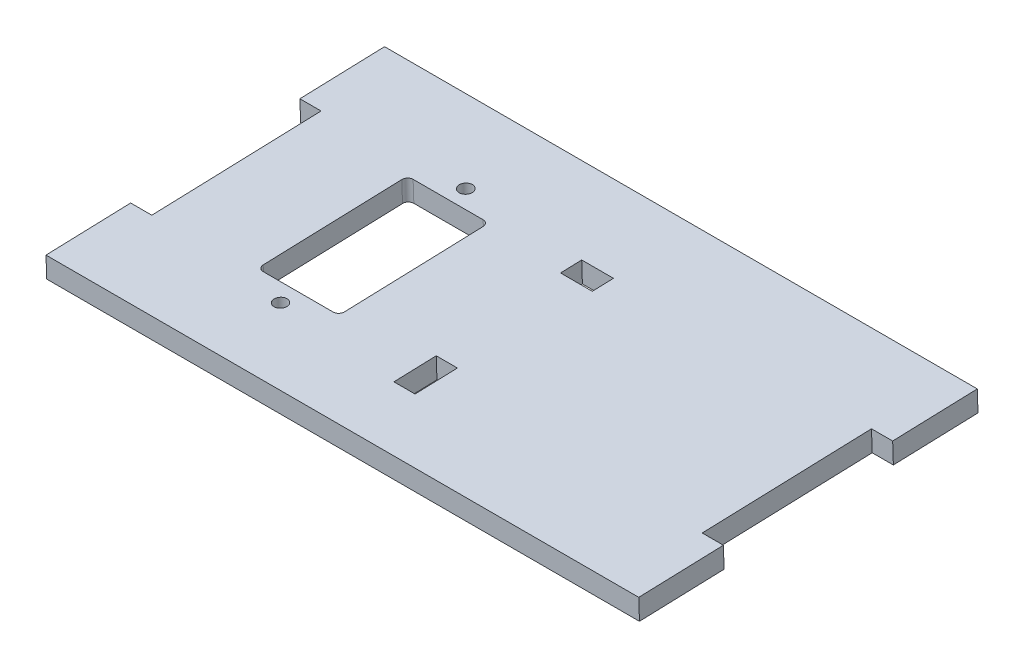
ISO-10303-21;
HEADER;
FILE_DESCRIPTION(('STEP AP214'),'2;1');
FILE_NAME('part.step','',(''),(''),'','','');
FILE_SCHEMA(('AUTOMOTIVE_DESIGN { 1 0 10303 214 1 1 1 1 }'));
ENDSEC;
DATA;
#1=APPLICATION_CONTEXT('core data for automotive mechanical design processes');
#2=APPLICATION_PROTOCOL_DEFINITION('international standard','automotive_design',2000,#1);
#3=PRODUCT_CONTEXT('',#1,'mechanical');
#4=PRODUCT('Part','Part','',(#3));
#5=PRODUCT_RELATED_PRODUCT_CATEGORY('part','',(#4));
#6=PRODUCT_DEFINITION_FORMATION('','',#4);
#7=PRODUCT_DEFINITION_CONTEXT('part definition',#1,'design');
#8=PRODUCT_DEFINITION('design','',#6,#7);
#9=PRODUCT_DEFINITION_SHAPE('','',#8);
#10=(LENGTH_UNIT() NAMED_UNIT(*) SI_UNIT(.MILLI.,.METRE.));
#11=(NAMED_UNIT(*) PLANE_ANGLE_UNIT() SI_UNIT($,.RADIAN.));
#12=(NAMED_UNIT(*) SI_UNIT($,.STERADIAN.) SOLID_ANGLE_UNIT());
#13=UNCERTAINTY_MEASURE_WITH_UNIT(LENGTH_MEASURE(1.E-05),#10,'distance_accuracy_value','');
#14=(GEOMETRIC_REPRESENTATION_CONTEXT(3) GLOBAL_UNCERTAINTY_ASSIGNED_CONTEXT((#13)) GLOBAL_UNIT_ASSIGNED_CONTEXT((#10,
#11,#12)) REPRESENTATION_CONTEXT('',''));
#15=CARTESIAN_POINT('',(0.,0.,0.));
#16=DIRECTION('',(0.,0.,1.));
#17=DIRECTION('',(1.,0.,0.));
#18=AXIS2_PLACEMENT_3D('',#15,#16,#17);
#19=CARTESIAN_POINT('',(0.,92.1531403658076,3.05679372771812));
#20=DIRECTION('',(0.,0.999450302475041,0.033152569772926));
#21=DIRECTION('',(0.,-0.033152569772926,0.999450302475041));
#22=AXIS2_PLACEMENT_3D('',#19,#20,#21);
#23=PLANE('',#22);
#24=CARTESIAN_POINT('',(8.37075843968437,75.2823159082097,511.661427475282));
#25=DIRECTION('',(0.,0.999450302475041,0.0331525697729258));
#26=DIRECTION('',(0.,-0.0331525697729258,0.999450302475041));
#27=AXIS2_PLACEMENT_3D('',#24,#25,#26);
#28=CIRCLE('',#27,0.979512635071814);
#29=CARTESIAN_POINT('',(8.37075843968437,75.249842547232,512.640401674683));
#30=VERTEX_POINT('',#29);
#31=EDGE_CURVE('E289',#30,#30,#28,.T.);
#32=ORIENTED_EDGE('',*,*,#31,.F.);
#33=EDGE_LOOP('',(#32));
#34=FACE_BOUND('',#33,.T.);
#35=DIRECTION('',(1.,0.,0.));
#36=VECTOR('',#35,1.);
#37=CARTESIAN_POINT('',(69.9558848829245,76.179424446265,484.616302290307));
#38=LINE('',#37,#36);
#39=CARTESIAN_POINT('',(69.9558848829245,76.179424446265,484.616302290307));
#40=VERTEX_POINT('',#39);
#41=CARTESIAN_POINT('',(73.1308848829245,76.179424446265,484.616302290307));
#42=VERTEX_POINT('',#41);
#43=EDGE_CURVE('E357',#40,#42,#38,.T.);
#44=ORIENTED_EDGE('',*,*,#43,.T.);
#45=DIRECTION('',(0.,0.033152569772926,-0.999450302475041));
#46=VECTOR('',#45,1.);
#47=CARTESIAN_POINT('',(73.1308848829245,76.179424446265,484.616302290307));
#48=LINE('',#47,#46);
#49=CARTESIAN_POINT('',(73.1308848829245,76.6004620823812,471.923283448874));
#50=VERTEX_POINT('',#49);
#51=EDGE_CURVE('E360',#42,#50,#48,.T.);
#52=ORIENTED_EDGE('',*,*,#51,.T.);
#53=DIRECTION('',(-1.,0.,0.));
#54=VECTOR('',#53,1.);
#55=CARTESIAN_POINT('',(73.1308848829245,76.6004620823812,471.923283448874));
#56=LINE('',#55,#54);
#57=CARTESIAN_POINT('',(-15.7691151170755,76.6004620823812,471.923283448874));
#58=VERTEX_POINT('',#57);
#59=EDGE_CURVE('E363',#50,#58,#56,.T.);
#60=ORIENTED_EDGE('',*,*,#59,.T.);
#61=DIRECTION('',(0.,-0.0331525697729249,0.999450302475041));
#62=VECTOR('',#61,1.);
#63=CARTESIAN_POINT('',(-15.7691151170755,76.6004620823812,471.923283448874));
#64=LINE('',#63,#62);
#65=CARTESIAN_POINT('',(-15.7691151170755,76.179424446265,484.616302290307));
#66=VERTEX_POINT('',#65);
#67=EDGE_CURVE('E365',#58,#66,#64,.T.);
#68=ORIENTED_EDGE('',*,*,#67,.T.);
#69=DIRECTION('',(1.,0.,0.));
#70=VECTOR('',#69,1.);
#71=CARTESIAN_POINT('',(-15.7691151170755,76.179424446265,484.616302290307));
#72=LINE('',#71,#70);
#73=CARTESIAN_POINT('',(-12.5941151170755,76.179424446265,484.616302290307));
#74=VERTEX_POINT('',#73);
#75=EDGE_CURVE('E367',#66,#74,#72,.T.);
#76=ORIENTED_EDGE('',*,*,#75,.T.);
#77=DIRECTION('',(0.,-0.0331525697729258,0.999450302475041));
#78=VECTOR('',#77,1.);
#79=CARTESIAN_POINT('',(-12.5941151170755,76.179424446265,484.616302290307));
#80=LINE('',#79,#78);
#81=CARTESIAN_POINT('',(-12.5941151170755,75.3373491740327,510.002339973174));
#82=VERTEX_POINT('',#81);
#83=EDGE_CURVE('E369',#74,#82,#80,.T.);
#84=ORIENTED_EDGE('',*,*,#83,.T.);
#85=DIRECTION('',(-1.,0.,0.));
#86=VECTOR('',#85,1.);
#87=CARTESIAN_POINT('',(-12.5941151170755,75.3373491740327,510.002339973174));
#88=LINE('',#87,#86);
#89=CARTESIAN_POINT('',(-15.7691151170755,75.3373491740327,510.002339973174));
#90=VERTEX_POINT('',#89);
#91=EDGE_CURVE('E371',#82,#90,#88,.T.);
#92=ORIENTED_EDGE('',*,*,#91,.T.);
#93=DIRECTION('',(0.,-0.0331525697729259,0.999450302475041));
#94=VECTOR('',#93,1.);
#95=CARTESIAN_POINT('',(-15.7691151170755,75.3373491740327,510.002339973174));
#96=LINE('',#95,#94);
#97=CARTESIAN_POINT('',(-15.7691151170755,74.9163115379166,522.695358814607));
#98=VERTEX_POINT('',#97);
#99=EDGE_CURVE('E373',#90,#98,#96,.T.);
#100=ORIENTED_EDGE('',*,*,#99,.T.);
#101=DIRECTION('',(1.,0.,0.));
#102=VECTOR('',#101,1.);
#103=CARTESIAN_POINT('',(-15.7691151170755,74.9163115379166,522.695358814607));
#104=LINE('',#103,#102);
#105=CARTESIAN_POINT('',(73.1308848829245,74.9163115379166,522.695358814607));
#106=VERTEX_POINT('',#105);
#107=EDGE_CURVE('E375',#98,#106,#104,.T.);
#108=ORIENTED_EDGE('',*,*,#107,.T.);
#109=DIRECTION('',(0.,0.0331525697729259,-0.999450302475041));
#110=VECTOR('',#109,1.);
#111=CARTESIAN_POINT('',(73.1308848829245,74.9163115379166,522.695358814607));
#112=LINE('',#111,#110);
#113=CARTESIAN_POINT('',(73.1308848829245,75.3373491740327,510.002339973174));
#114=VERTEX_POINT('',#113);
#115=EDGE_CURVE('E377',#106,#114,#112,.T.);
#116=ORIENTED_EDGE('',*,*,#115,.T.);
#117=DIRECTION('',(-1.,0.,0.));
#118=VECTOR('',#117,1.);
#119=CARTESIAN_POINT('',(73.1308848829245,75.3373491740327,510.002339973174));
#120=LINE('',#119,#118);
#121=CARTESIAN_POINT('',(69.9558848829245,75.3373491740327,510.002339973174));
#122=VERTEX_POINT('',#121);
#123=EDGE_CURVE('E379',#114,#122,#120,.T.);
#124=ORIENTED_EDGE('',*,*,#123,.T.);
#125=DIRECTION('',(0.,0.0331525697729258,-0.999450302475041));
#126=VECTOR('',#125,1.);
#127=CARTESIAN_POINT('',(69.9558848829245,75.3373491740327,510.002339973174));
#128=LINE('',#127,#126);
#129=EDGE_CURVE('E381',#122,#40,#128,.T.);
#130=ORIENTED_EDGE('',*,*,#129,.T.);
#131=EDGE_LOOP('',(#44,#52,#60,#68,#76,#84,#92,#100,#108,#116,#124,#130));
#132=FACE_BOUND('',#131,.T.);
#133=DIRECTION('',(0.,0.0331525697729272,-0.999450302475041));
#134=VECTOR('',#133,1.);
#135=CARTESIAN_POINT('',(31.0655535590126,76.0804806017778,487.599161718044));
#136=LINE('',#135,#134);
#137=CARTESIAN_POINT('',(31.0655535590126,76.0804806017778,487.599161718044));
#138=VERTEX_POINT('',#137);
#139=CARTESIAN_POINT('',(31.0655535590126,76.1857400108068,484.425907007686));
#140=VERTEX_POINT('',#139);
#141=EDGE_CURVE('E328',#138,#140,#136,.T.);
#142=ORIENTED_EDGE('',*,*,#141,.F.);
#143=DIRECTION('',(1.,0.,0.));
#144=VECTOR('',#143,1.);
#145=CARTESIAN_POINT('',(26.3030535590126,76.0804806017778,487.599161718044));
#146=LINE('',#145,#144);
#147=CARTESIAN_POINT('',(26.3030535590126,76.0804806017778,487.599161718044));
#148=VERTEX_POINT('',#147);
#149=EDGE_CURVE('E326',#148,#138,#146,.T.);
#150=ORIENTED_EDGE('',*,*,#149,.F.);
#151=DIRECTION('',(0.,-0.0331525697729272,0.999450302475041));
#152=VECTOR('',#151,1.);
#153=CARTESIAN_POINT('',(26.3030535590126,76.1857400108068,484.425907007686));
#154=LINE('',#153,#152);
#155=CARTESIAN_POINT('',(26.3030535590126,76.1857400108068,484.425907007686));
#156=VERTEX_POINT('',#155);
#157=EDGE_CURVE('E334',#156,#148,#154,.T.);
#158=ORIENTED_EDGE('',*,*,#157,.F.);
#159=DIRECTION('',(-1.,0.,0.));
#160=VECTOR('',#159,1.);
#161=CARTESIAN_POINT('',(31.0655535590126,76.1857400108068,484.425907007686));
#162=LINE('',#161,#160);
#163=EDGE_CURVE('E331',#140,#156,#162,.T.);
#164=ORIENTED_EDGE('',*,*,#163,.F.);
#165=EDGE_LOOP('',(#142,#150,#158,#164));
#166=FACE_BOUND('',#165,.T.);
#167=DIRECTION('',(0.,-0.0331525697729251,0.999450302475041));
#168=VECTOR('',#167,1.);
#169=CARTESIAN_POINT('',(27.0933848829245,75.4359127040353,507.030945883703));
#170=LINE('',#169,#168);
#171=CARTESIAN_POINT('',(27.0933848829245,75.4359127040353,507.030945883703));
#172=VERTEX_POINT('',#171);
#173=CARTESIAN_POINT('',(27.0933848829245,75.2253938859772,513.37745530442));
#174=VERTEX_POINT('',#173);
#175=EDGE_CURVE('E297',#172,#174,#170,.T.);
#176=ORIENTED_EDGE('',*,*,#175,.F.);
#177=DIRECTION('',(-1.,0.,0.));
#178=VECTOR('',#177,1.);
#179=CARTESIAN_POINT('',(30.2683848829244,75.4359127040353,507.030945883703));
#180=LINE('',#179,#178);
#181=CARTESIAN_POINT('',(30.2683848829244,75.4359127040353,507.030945883703));
#182=VERTEX_POINT('',#181);
#183=EDGE_CURVE('E295',#182,#172,#180,.T.);
#184=ORIENTED_EDGE('',*,*,#183,.F.);
#185=DIRECTION('',(0.,0.0331525697729251,-0.999450302475041));
#186=VECTOR('',#185,1.);
#187=CARTESIAN_POINT('',(30.2683848829244,75.2253938859772,513.37745530442));
#188=LINE('',#187,#186);
#189=CARTESIAN_POINT('',(30.2683848829245,75.2253938859772,513.37745530442));
#190=VERTEX_POINT('',#189);
#191=EDGE_CURVE('E303',#190,#182,#188,.T.);
#192=ORIENTED_EDGE('',*,*,#191,.F.);
#193=DIRECTION('',(1.,0.,0.));
#194=VECTOR('',#193,1.);
#195=CARTESIAN_POINT('',(27.0933848829245,75.2253938859772,513.37745530442));
#196=LINE('',#195,#194);
#197=EDGE_CURVE('E300',#174,#190,#196,.T.);
#198=ORIENTED_EDGE('',*,*,#197,.F.);
#199=EDGE_LOOP('',(#176,#184,#192,#198));
#200=FACE_BOUND('',#199,.T.);
#201=CARTESIAN_POINT('',(8.37075843968437,76.203957347897,483.876709066476));
#202=DIRECTION('',(0.,0.999450302475041,0.0331525697729258));
#203=DIRECTION('',(0.,-0.0331525697729258,0.999450302475041));
#204=AXIS2_PLACEMENT_3D('',#201,#202,#203);
#205=CIRCLE('',#204,1.00000000000001);
#206=CARTESIAN_POINT('',(8.37075843968437,76.1708047781241,484.876159368951));
#207=VERTEX_POINT('',#206);
#208=EDGE_CURVE('E283',#207,#207,#205,.T.);
#209=ORIENTED_EDGE('',*,*,#208,.F.);
#210=EDGE_LOOP('',(#209));
#211=FACE_BOUND('',#210,.T.);
#212=DIRECTION('',(-1.,0.,0.));
#213=VECTOR('',#212,1.);
#214=CARTESIAN_POINT('',(13.6207584396844,76.1161030379988,486.525252368035));
#215=LINE('',#214,#213);
#216=CARTESIAN_POINT('',(13.6207584396844,76.1161030379988,486.525252368035));
#217=VERTEX_POINT('',#216);
#218=CARTESIAN_POINT('',(3.12075843968437,76.1161030379988,486.525252368035));
#219=VERTEX_POINT('',#218);
#220=EDGE_CURVE('E226',#217,#219,#215,.T.);
#221=ORIENTED_EDGE('',*,*,#220,.F.);
#222=CARTESIAN_POINT('',(13.6207584396844,76.0879233536918,487.374785125139));
#223=DIRECTION('',(0.,0.999450302475041,0.0331525697729258));
#224=DIRECTION('',(0.,-0.0331525697729258,0.999450302475041));
#225=AXIS2_PLACEMENT_3D('',#222,#223,#224);
#226=CIRCLE('',#225,0.849999999999957);
#227=CARTESIAN_POINT('',(14.4707584396844,76.0879233536918,487.374785125139));
#228=VERTEX_POINT('',#227);
#229=EDGE_CURVE('E218',#228,#217,#226,.T.);
#230=ORIENTED_EDGE('',*,*,#229,.F.);
#231=DIRECTION('',(0.,0.0331525697729259,-0.999450302475041));
#232=VECTOR('',#231,1.);
#233=CARTESIAN_POINT('',(14.4707584396844,75.3983499024149,508.163351416619));
#234=LINE('',#233,#232);
#235=CARTESIAN_POINT('',(14.4707584396844,75.3983499024149,508.163351416619));
#236=VERTEX_POINT('',#235);
#237=EDGE_CURVE('E251',#236,#228,#234,.T.);
#238=ORIENTED_EDGE('',*,*,#237,.F.);
#239=CARTESIAN_POINT('',(13.6207584396844,75.3983499024149,508.163351416619));
#240=DIRECTION('',(0.,0.999450302475041,0.0331525697729258));
#241=DIRECTION('',(0.,-0.0331525697729258,0.999450302475041));
#242=AXIS2_PLACEMENT_3D('',#239,#240,#241);
#243=CIRCLE('',#242,0.85000000000004);
#244=CARTESIAN_POINT('',(13.6207584396844,75.3701702181079,509.012884173723));
#245=VERTEX_POINT('',#244);
#246=EDGE_CURVE('E249',#245,#236,#243,.T.);
#247=ORIENTED_EDGE('',*,*,#246,.F.);
#248=DIRECTION('',(1.,0.,0.));
#249=VECTOR('',#248,1.);
#250=CARTESIAN_POINT('',(3.12075843968437,75.3701702181079,509.012884173723));
#251=LINE('',#250,#249);
#252=CARTESIAN_POINT('',(3.12075843968437,75.3701702181079,509.012884173723));
#253=VERTEX_POINT('',#252);
#254=EDGE_CURVE('E247',#253,#245,#251,.T.);
#255=ORIENTED_EDGE('',*,*,#254,.F.);
#256=CARTESIAN_POINT('',(3.12075843968437,75.3983499024149,508.163351416619));
#257=DIRECTION('',(0.,0.999450302475041,0.0331525697729258));
#258=DIRECTION('',(0.,-0.0331525697729258,0.999450302475041));
#259=AXIS2_PLACEMENT_3D('',#256,#257,#258);
#260=CIRCLE('',#259,0.85000000000004);
#261=CARTESIAN_POINT('',(2.27075843968433,75.3983499024149,508.163351416619));
#262=VERTEX_POINT('',#261);
#263=EDGE_CURVE('E245',#262,#253,#260,.T.);
#264=ORIENTED_EDGE('',*,*,#263,.F.);
#265=DIRECTION('',(0.,-0.0331525697729259,0.999450302475041));
#266=VECTOR('',#265,1.);
#267=CARTESIAN_POINT('',(2.27075843968437,76.0879233536918,487.374785125139));
#268=LINE('',#267,#266);
#269=CARTESIAN_POINT('',(2.27075843968437,76.0879233536918,487.374785125139));
#270=VERTEX_POINT('',#269);
#271=EDGE_CURVE('E241',#270,#262,#268,.T.);
#272=ORIENTED_EDGE('',*,*,#271,.F.);
#273=CARTESIAN_POINT('',(3.12075843968437,76.0879233536918,487.374785125139));
#274=DIRECTION('',(0.,0.999450302475041,0.0331525697729258));
#275=DIRECTION('',(0.,-0.0331525697729258,0.999450302475041));
#276=AXIS2_PLACEMENT_3D('',#273,#274,#275);
#277=CIRCLE('',#276,0.849999999999957);
#278=EDGE_CURVE('E239',#219,#270,#277,.T.);
#279=ORIENTED_EDGE('',*,*,#278,.F.);
#280=EDGE_LOOP('',(#221,#230,#238,#247,#255,#264,#272,#279));
#281=FACE_BOUND('',#280,.T.);
#282=ADVANCED_FACE('F33',(#34,#132,#166,#200,#211,#281),#23,.T.);
#283=CARTESIAN_POINT('',(0.,88.9798856554494,2.95153431868908));
#284=DIRECTION('',(0.,0.999450302475041,0.033152569772926));
#285=DIRECTION('',(0.,-0.033152569772926,0.999450302475041));
#286=AXIS2_PLACEMENT_3D('',#283,#284,#285);
#287=PLANE('',#286);
#288=CARTESIAN_POINT('',(8.37075843968437,73.0307026375388,483.771449657447));
#289=DIRECTION('',(0.,0.999450302475041,0.0331525697729258));
#290=DIRECTION('',(0.,-0.0331525697729258,0.999450302475041));
#291=AXIS2_PLACEMENT_3D('',#288,#289,#290);
#292=CIRCLE('',#291,0.999999999999982);
#293=CARTESIAN_POINT('',(8.37075843968437,72.9975500677658,484.770899959922));
#294=VERTEX_POINT('',#293);
#295=EDGE_CURVE('E234',#294,#294,#292,.T.);
#296=ORIENTED_EDGE('',*,*,#295,.T.);
#297=EDGE_LOOP('',(#296));
#298=FACE_BOUND('',#297,.T.);
#299=CARTESIAN_POINT('',(8.37075843968437,72.1090611978514,511.556168066253));
#300=DIRECTION('',(0.,0.999450302475041,0.0331525697729258));
#301=DIRECTION('',(0.,-0.0331525697729258,0.999450302475041));
#302=AXIS2_PLACEMENT_3D('',#299,#300,#301);
#303=CIRCLE('',#302,0.979512635071815);
#304=CARTESIAN_POINT('',(8.37075843968437,72.0765878368737,512.535142265654));
#305=VERTEX_POINT('',#304);
#306=EDGE_CURVE('E286',#305,#305,#303,.T.);
#307=ORIENTED_EDGE('',*,*,#306,.T.);
#308=EDGE_LOOP('',(#307));
#309=FACE_BOUND('',#308,.T.);
#310=DIRECTION('',(-1.,0.,0.));
#311=VECTOR('',#310,1.);
#312=CARTESIAN_POINT('',(30.2683848829244,72.262657993677,506.925686474674));
#313=LINE('',#312,#311);
#314=CARTESIAN_POINT('',(30.2683848829245,72.262657993677,506.925686474674));
#315=VERTEX_POINT('',#314);
#316=CARTESIAN_POINT('',(27.0933848829245,72.262657993677,506.925686474674));
#317=VERTEX_POINT('',#316);
#318=EDGE_CURVE('E292',#315,#317,#313,.T.);
#319=ORIENTED_EDGE('',*,*,#318,.T.);
#320=DIRECTION('',(0.,-0.0331525697729251,0.999450302475041));
#321=VECTOR('',#320,1.);
#322=CARTESIAN_POINT('',(27.0933848829245,72.262657993677,506.925686474674));
#323=LINE('',#322,#321);
#324=CARTESIAN_POINT('',(27.0933848829245,72.0521391756189,513.27219589539));
#325=VERTEX_POINT('',#324);
#326=EDGE_CURVE('E308',#317,#325,#323,.T.);
#327=ORIENTED_EDGE('',*,*,#326,.T.);
#328=DIRECTION('',(1.,0.,0.));
#329=VECTOR('',#328,1.);
#330=CARTESIAN_POINT('',(27.0933848829245,72.0521391756189,513.27219589539));
#331=LINE('',#330,#329);
#332=CARTESIAN_POINT('',(30.2683848829244,72.0521391756189,513.27219589539));
#333=VERTEX_POINT('',#332);
#334=EDGE_CURVE('E311',#325,#333,#331,.T.);
#335=ORIENTED_EDGE('',*,*,#334,.T.);
#336=DIRECTION('',(0.,0.0331525697729251,-0.999450302475041));
#337=VECTOR('',#336,1.);
#338=CARTESIAN_POINT('',(30.2683848829244,72.0521391756189,513.27219589539));
#339=LINE('',#338,#337);
#340=EDGE_CURVE('E298',#333,#315,#339,.T.);
#341=ORIENTED_EDGE('',*,*,#340,.T.);
#342=EDGE_LOOP('',(#319,#327,#335,#341));
#343=FACE_BOUND('',#342,.T.);
#344=DIRECTION('',(1.,0.,0.));
#345=VECTOR('',#344,1.);
#346=CARTESIAN_POINT('',(69.9558848829245,73.0061697359068,484.511042881278));
#347=LINE('',#346,#345);
#348=CARTESIAN_POINT('',(69.9558848829245,73.0061697359068,484.511042881278));
#349=VERTEX_POINT('',#348);
#350=CARTESIAN_POINT('',(73.1308848829245,73.0061697359068,484.511042881278));
#351=VERTEX_POINT('',#350);
#352=EDGE_CURVE('E356',#349,#351,#347,.T.);
#353=ORIENTED_EDGE('',*,*,#352,.F.);
#354=DIRECTION('',(0.,0.0331525697729258,-0.999450302475041));
#355=VECTOR('',#354,1.);
#356=CARTESIAN_POINT('',(69.9558848829245,72.1640944636745,509.897080564145));
#357=LINE('',#356,#355);
#358=CARTESIAN_POINT('',(69.9558848829245,72.1640944636745,509.897080564145));
#359=VERTEX_POINT('',#358);
#360=EDGE_CURVE('E361',#359,#349,#357,.T.);
#361=ORIENTED_EDGE('',*,*,#360,.F.);
#362=DIRECTION('',(-1.,0.,0.));
#363=VECTOR('',#362,1.);
#364=CARTESIAN_POINT('',(73.1308848829245,72.1640944636745,509.897080564145));
#365=LINE('',#364,#363);
#366=CARTESIAN_POINT('',(73.1308848829245,72.1640944636745,509.897080564145));
#367=VERTEX_POINT('',#366);
#368=EDGE_CURVE('E404',#367,#359,#365,.T.);
#369=ORIENTED_EDGE('',*,*,#368,.F.);
#370=DIRECTION('',(0.,0.0331525697729259,-0.999450302475041));
#371=VECTOR('',#370,1.);
#372=CARTESIAN_POINT('',(73.1308848829245,71.7430568275583,522.590099405578));
#373=LINE('',#372,#371);
#374=CARTESIAN_POINT('',(73.1308848829245,71.7430568275583,522.590099405578));
#375=VERTEX_POINT('',#374);
#376=EDGE_CURVE('E402',#375,#367,#373,.T.);
#377=ORIENTED_EDGE('',*,*,#376,.F.);
#378=DIRECTION('',(1.,0.,0.));
#379=VECTOR('',#378,1.);
#380=CARTESIAN_POINT('',(-15.7691151170755,71.7430568275583,522.590099405578));
#381=LINE('',#380,#379);
#382=CARTESIAN_POINT('',(-15.7691151170755,71.7430568275583,522.590099405578));
#383=VERTEX_POINT('',#382);
#384=EDGE_CURVE('E400',#383,#375,#381,.T.);
#385=ORIENTED_EDGE('',*,*,#384,.F.);
#386=DIRECTION('',(0.,-0.0331525697729259,0.999450302475041));
#387=VECTOR('',#386,1.);
#388=CARTESIAN_POINT('',(-15.7691151170755,72.1640944636745,509.897080564145));
#389=LINE('',#388,#387);
#390=CARTESIAN_POINT('',(-15.7691151170755,72.1640944636745,509.897080564145));
#391=VERTEX_POINT('',#390);
#392=EDGE_CURVE('E398',#391,#383,#389,.T.);
#393=ORIENTED_EDGE('',*,*,#392,.F.);
#394=DIRECTION('',(-1.,0.,0.));
#395=VECTOR('',#394,1.);
#396=CARTESIAN_POINT('',(-12.5941151170755,72.1640944636745,509.897080564145));
#397=LINE('',#396,#395);
#398=CARTESIAN_POINT('',(-12.5941151170755,72.1640944636745,509.897080564145));
#399=VERTEX_POINT('',#398);
#400=EDGE_CURVE('E396',#399,#391,#397,.T.);
#401=ORIENTED_EDGE('',*,*,#400,.F.);
#402=DIRECTION('',(0.,-0.0331525697729258,0.999450302475041));
#403=VECTOR('',#402,1.);
#404=CARTESIAN_POINT('',(-12.5941151170755,73.0061697359068,484.511042881278));
#405=LINE('',#404,#403);
#406=CARTESIAN_POINT('',(-12.5941151170755,73.0061697359068,484.511042881278));
#407=VERTEX_POINT('',#406);
#408=EDGE_CURVE('E394',#407,#399,#405,.T.);
#409=ORIENTED_EDGE('',*,*,#408,.F.);
#410=DIRECTION('',(1.,0.,0.));
#411=VECTOR('',#410,1.);
#412=CARTESIAN_POINT('',(-15.7691151170755,73.0061697359068,484.511042881278));
#413=LINE('',#412,#411);
#414=CARTESIAN_POINT('',(-15.7691151170755,73.0061697359068,484.511042881278));
#415=VERTEX_POINT('',#414);
#416=EDGE_CURVE('E392',#415,#407,#413,.T.);
#417=ORIENTED_EDGE('',*,*,#416,.F.);
#418=DIRECTION('',(0.,-0.0331525697729249,0.999450302475041));
#419=VECTOR('',#418,1.);
#420=CARTESIAN_POINT('',(-15.7691151170755,73.4272073720229,471.818024039845));
#421=LINE('',#420,#419);
#422=CARTESIAN_POINT('',(-15.7691151170755,73.4272073720229,471.818024039845));
#423=VERTEX_POINT('',#422);
#424=EDGE_CURVE('E390',#423,#415,#421,.T.);
#425=ORIENTED_EDGE('',*,*,#424,.F.);
#426=DIRECTION('',(-1.,0.,0.));
#427=VECTOR('',#426,1.);
#428=CARTESIAN_POINT('',(73.1308848829245,73.4272073720229,471.818024039845));
#429=LINE('',#428,#427);
#430=CARTESIAN_POINT('',(73.1308848829245,73.4272073720229,471.818024039845));
#431=VERTEX_POINT('',#430);
#432=EDGE_CURVE('E388',#431,#423,#429,.T.);
#433=ORIENTED_EDGE('',*,*,#432,.F.);
#434=DIRECTION('',(0.,0.033152569772926,-0.999450302475041));
#435=VECTOR('',#434,1.);
#436=CARTESIAN_POINT('',(73.1308848829245,73.0061697359068,484.511042881278));
#437=LINE('',#436,#435);
#438=EDGE_CURVE('E386',#351,#431,#437,.T.);
#439=ORIENTED_EDGE('',*,*,#438,.F.);
#440=EDGE_LOOP('',(#353,#361,#369,#377,#385,#393,#401,#409,#417,#425,#433,#439));
#441=FACE_BOUND('',#440,.T.);
#442=DIRECTION('',(1.,0.,0.));
#443=VECTOR('',#442,1.);
#444=CARTESIAN_POINT('',(26.3030535590126,72.9072258914195,487.493902309015));
#445=LINE('',#444,#443);
#446=CARTESIAN_POINT('',(26.3030535590126,72.9072258914195,487.493902309016));
#447=VERTEX_POINT('',#446);
#448=CARTESIAN_POINT('',(31.0655535590126,72.9072258914195,487.493902309015));
#449=VERTEX_POINT('',#448);
#450=EDGE_CURVE('E325',#447,#449,#445,.T.);
#451=ORIENTED_EDGE('',*,*,#450,.T.);
#452=DIRECTION('',(0.,0.0331525697729272,-0.999450302475041));
#453=VECTOR('',#452,1.);
#454=CARTESIAN_POINT('',(31.0655535590126,72.9072258914195,487.493902309015));
#455=LINE('',#454,#453);
#456=CARTESIAN_POINT('',(31.0655535590126,73.0124853004485,484.320647598657));
#457=VERTEX_POINT('',#456);
#458=EDGE_CURVE('E339',#449,#457,#455,.T.);
#459=ORIENTED_EDGE('',*,*,#458,.T.);
#460=DIRECTION('',(-1.,0.,0.));
#461=VECTOR('',#460,1.);
#462=CARTESIAN_POINT('',(31.0655535590126,73.0124853004485,484.320647598657));
#463=LINE('',#462,#461);
#464=CARTESIAN_POINT('',(26.3030535590126,73.0124853004485,484.320647598657));
#465=VERTEX_POINT('',#464);
#466=EDGE_CURVE('E342',#457,#465,#463,.T.);
#467=ORIENTED_EDGE('',*,*,#466,.T.);
#468=DIRECTION('',(0.,-0.0331525697729272,0.999450302475041));
#469=VECTOR('',#468,1.);
#470=CARTESIAN_POINT('',(26.3030535590126,73.0124853004485,484.320647598657));
#471=LINE('',#470,#469);
#472=EDGE_CURVE('E329',#465,#447,#471,.T.);
#473=ORIENTED_EDGE('',*,*,#472,.T.);
#474=EDGE_LOOP('',(#451,#459,#467,#473));
#475=FACE_BOUND('',#474,.T.);
#476=CARTESIAN_POINT('',(13.6207584396844,72.9146686433335,487.26952571611));
#477=DIRECTION('',(0.,0.999450302475041,0.0331525697729258));
#478=DIRECTION('',(0.,-0.0331525697729258,0.999450302475041));
#479=AXIS2_PLACEMENT_3D('',#476,#477,#478);
#480=CIRCLE('',#479,0.849999999999957);
#481=CARTESIAN_POINT('',(14.4707584396844,72.9146686433335,487.26952571611));
#482=VERTEX_POINT('',#481);
#483=CARTESIAN_POINT('',(13.6207584396844,72.9428483276405,486.419992959006));
#484=VERTEX_POINT('',#483);
#485=EDGE_CURVE('E56',#482,#484,#480,.T.);
#486=ORIENTED_EDGE('',*,*,#485,.T.);
#487=DIRECTION('',(-1.,0.,0.));
#488=VECTOR('',#487,1.);
#489=CARTESIAN_POINT('',(13.6207584396844,72.9428483276405,486.419992959006));
#490=LINE('',#489,#488);
#491=CARTESIAN_POINT('',(3.12075843968437,72.9428483276405,486.419992959006));
#492=VERTEX_POINT('',#491);
#493=EDGE_CURVE('E233',#484,#492,#490,.T.);
#494=ORIENTED_EDGE('',*,*,#493,.T.);
#495=CARTESIAN_POINT('',(3.12075843968437,72.9146686433335,487.26952571611));
#496=DIRECTION('',(0.,0.999450302475041,0.0331525697729258));
#497=DIRECTION('',(0.,-0.0331525697729258,0.999450302475041));
#498=AXIS2_PLACEMENT_3D('',#495,#496,#497);
#499=CIRCLE('',#498,0.849999999999957);
#500=CARTESIAN_POINT('',(2.27075843968437,72.9146686433335,487.26952571611));
#501=VERTEX_POINT('',#500);
#502=EDGE_CURVE('E255',#492,#501,#499,.T.);
#503=ORIENTED_EDGE('',*,*,#502,.T.);
#504=DIRECTION('',(0.,-0.0331525697729259,0.999450302475041));
#505=VECTOR('',#504,1.);
#506=CARTESIAN_POINT('',(2.27075843968437,72.9146686433335,487.26952571611));
#507=LINE('',#506,#505);
#508=CARTESIAN_POINT('',(2.27075843968433,72.2250951920567,508.05809200759));
#509=VERTEX_POINT('',#508);
#510=EDGE_CURVE('E258',#501,#509,#507,.T.);
#511=ORIENTED_EDGE('',*,*,#510,.T.);
#512=CARTESIAN_POINT('',(3.12075843968437,72.2250951920567,508.05809200759));
#513=DIRECTION('',(0.,0.999450302475041,0.0331525697729258));
#514=DIRECTION('',(0.,-0.0331525697729258,0.999450302475041));
#515=AXIS2_PLACEMENT_3D('',#512,#513,#514);
#516=CIRCLE('',#515,0.85000000000004);
#517=CARTESIAN_POINT('',(3.12075843968437,72.1969155077497,508.907624764694));
#518=VERTEX_POINT('',#517);
#519=EDGE_CURVE('E261',#509,#518,#516,.T.);
#520=ORIENTED_EDGE('',*,*,#519,.T.);
#521=DIRECTION('',(1.,0.,0.));
#522=VECTOR('',#521,1.);
#523=CARTESIAN_POINT('',(3.12075843968437,72.1969155077497,508.907624764694));
#524=LINE('',#523,#522);
#525=CARTESIAN_POINT('',(13.6207584396844,72.1969155077497,508.907624764694));
#526=VERTEX_POINT('',#525);
#527=EDGE_CURVE('E264',#518,#526,#524,.T.);
#528=ORIENTED_EDGE('',*,*,#527,.T.);
#529=CARTESIAN_POINT('',(13.6207584396844,72.2250951920567,508.05809200759));
#530=DIRECTION('',(0.,0.999450302475041,0.0331525697729258));
#531=DIRECTION('',(0.,-0.0331525697729258,0.999450302475041));
#532=AXIS2_PLACEMENT_3D('',#529,#530,#531);
#533=CIRCLE('',#532,0.85000000000004);
#534=CARTESIAN_POINT('',(14.4707584396844,72.2250951920567,508.05809200759));
#535=VERTEX_POINT('',#534);
#536=EDGE_CURVE('E267',#526,#535,#533,.T.);
#537=ORIENTED_EDGE('',*,*,#536,.T.);
#538=DIRECTION('',(0.,0.0331525697729259,-0.999450302475041));
#539=VECTOR('',#538,1.);
#540=CARTESIAN_POINT('',(14.4707584396844,72.2250951920567,508.05809200759));
#541=LINE('',#540,#539);
#542=EDGE_CURVE('E227',#535,#482,#541,.T.);
#543=ORIENTED_EDGE('',*,*,#542,.T.);
#544=EDGE_LOOP('',(#486,#494,#503,#511,#520,#528,#537,#543));
#545=FACE_BOUND('',#544,.T.);
#546=ADVANCED_FACE('F446',(#298,#309,#343,#441,#475,#545),#287,.F.);
#547=CARTESIAN_POINT('',(69.9558848829245,76.179424446265,484.616302290307));
#548=DIRECTION('',(0.,0.0331525697729258,-0.999450302475041));
#549=DIRECTION('',(0.,0.999450302475041,0.0331525697729258));
#550=AXIS2_PLACEMENT_3D('',#547,#548,#549);
#551=PLANE('',#550);
#552=ORIENTED_EDGE('',*,*,#352,.T.);
#553=DIRECTION('',(0.,-0.999450302475041,-0.0331525697729258));
#554=VECTOR('',#553,1.);
#555=CARTESIAN_POINT('',(73.1308848829245,76.179424446265,484.616302290307));
#556=LINE('',#555,#554);
#557=EDGE_CURVE('E11',#42,#351,#556,.T.);
#558=ORIENTED_EDGE('',*,*,#557,.F.);
#559=ORIENTED_EDGE('',*,*,#43,.F.);
#560=DIRECTION('',(0.,-0.999450302475041,-0.0331525697729258));
#561=VECTOR('',#560,1.);
#562=CARTESIAN_POINT('',(69.9558848829245,76.179424446265,484.616302290307));
#563=LINE('',#562,#561);
#564=EDGE_CURVE('E383',#40,#349,#563,.T.);
#565=ORIENTED_EDGE('',*,*,#564,.T.);
#566=EDGE_LOOP('',(#552,#558,#559,#565));
#567=FACE_BOUND('',#566,.T.);
#568=ADVANCED_FACE('F35',(#567),#551,.F.);
#569=CARTESIAN_POINT('',(73.1308848829245,76.179424446265,484.616302290307));
#570=DIRECTION('',(-1.,0.,0.));
#571=DIRECTION('',(0.,0.,1.));
#572=AXIS2_PLACEMENT_3D('',#569,#570,#571);
#573=PLANE('',#572);
#574=ORIENTED_EDGE('',*,*,#438,.T.);
#575=DIRECTION('',(0.,-0.999450302475041,-0.0331525697729258));
#576=VECTOR('',#575,1.);
#577=CARTESIAN_POINT('',(73.1308848829245,76.6004620823812,471.923283448874));
#578=LINE('',#577,#576);
#579=EDGE_CURVE('E41',#50,#431,#578,.T.);
#580=ORIENTED_EDGE('',*,*,#579,.F.);
#581=ORIENTED_EDGE('',*,*,#51,.F.);
#582=ORIENTED_EDGE('',*,*,#557,.T.);
#583=EDGE_LOOP('',(#574,#580,#581,#582));
#584=FACE_BOUND('',#583,.T.);
#585=ADVANCED_FACE('F464',(#584),#573,.F.);
#586=CARTESIAN_POINT('',(73.1308848829245,76.6004620823812,471.923283448874));
#587=DIRECTION('',(0.,-0.0331525697729258,0.999450302475041));
#588=DIRECTION('',(0.,-0.999450302475041,-0.0331525697729258));
#589=AXIS2_PLACEMENT_3D('',#586,#587,#588);
#590=PLANE('',#589);
#591=ORIENTED_EDGE('',*,*,#432,.T.);
#592=DIRECTION('',(0.,-0.999450302475041,-0.0331525697729258));
#593=VECTOR('',#592,1.);
#594=CARTESIAN_POINT('',(-15.7691151170755,76.6004620823812,471.923283448874));
#595=LINE('',#594,#593);
#596=EDGE_CURVE('E433',#58,#423,#595,.T.);
#597=ORIENTED_EDGE('',*,*,#596,.F.);
#598=ORIENTED_EDGE('',*,*,#59,.F.);
#599=ORIENTED_EDGE('',*,*,#579,.T.);
#600=EDGE_LOOP('',(#591,#597,#598,#599));
#601=FACE_BOUND('',#600,.T.);
#602=ADVANCED_FACE('F440',(#601),#590,.F.);
#603=CARTESIAN_POINT('',(-15.7691151170755,76.6004620823812,471.923283448874));
#604=DIRECTION('',(1.,0.,0.));
#605=DIRECTION('',(0.,0.,-1.));
#606=AXIS2_PLACEMENT_3D('',#603,#604,#605);
#607=PLANE('',#606);
#608=ORIENTED_EDGE('',*,*,#424,.T.);
#609=DIRECTION('',(0.,-0.999450302475041,-0.0331525697729258));
#610=VECTOR('',#609,1.);
#611=CARTESIAN_POINT('',(-15.7691151170755,76.179424446265,484.616302290307));
#612=LINE('',#611,#610);
#613=EDGE_CURVE('E430',#66,#415,#612,.T.);
#614=ORIENTED_EDGE('',*,*,#613,.F.);
#615=ORIENTED_EDGE('',*,*,#67,.F.);
#616=ORIENTED_EDGE('',*,*,#596,.T.);
#617=EDGE_LOOP('',(#608,#614,#615,#616));
#618=FACE_BOUND('',#617,.T.);
#619=ADVANCED_FACE('F452',(#618),#607,.F.);
#620=CARTESIAN_POINT('',(-15.7691151170755,76.179424446265,484.616302290307));
#621=DIRECTION('',(0.,0.0331525697729258,-0.999450302475041));
#622=DIRECTION('',(0.,0.999450302475041,0.0331525697729258));
#623=AXIS2_PLACEMENT_3D('',#620,#621,#622);
#624=PLANE('',#623);
#625=ORIENTED_EDGE('',*,*,#416,.T.);
#626=DIRECTION('',(0.,-0.999450302475041,-0.0331525697729258));
#627=VECTOR('',#626,1.);
#628=CARTESIAN_POINT('',(-12.5941151170755,76.179424446265,484.616302290307));
#629=LINE('',#628,#627);
#630=EDGE_CURVE('E427',#74,#407,#629,.T.);
#631=ORIENTED_EDGE('',*,*,#630,.F.);
#632=ORIENTED_EDGE('',*,*,#75,.F.);
#633=ORIENTED_EDGE('',*,*,#613,.T.);
#634=EDGE_LOOP('',(#625,#631,#632,#633));
#635=FACE_BOUND('',#634,.T.);
#636=ADVANCED_FACE('F456',(#635),#624,.F.);
#637=CARTESIAN_POINT('',(-12.5941151170755,76.179424446265,484.616302290307));
#638=DIRECTION('',(1.,0.,0.));
#639=DIRECTION('',(0.,0.,-1.));
#640=AXIS2_PLACEMENT_3D('',#637,#638,#639);
#641=PLANE('',#640);
#642=ORIENTED_EDGE('',*,*,#408,.T.);
#643=DIRECTION('',(0.,-0.999450302475041,-0.0331525697729258));
#644=VECTOR('',#643,1.);
#645=CARTESIAN_POINT('',(-12.5941151170755,75.3373491740327,510.002339973174));
#646=LINE('',#645,#644);
#647=EDGE_CURVE('E424',#82,#399,#646,.T.);
#648=ORIENTED_EDGE('',*,*,#647,.F.);
#649=ORIENTED_EDGE('',*,*,#83,.F.);
#650=ORIENTED_EDGE('',*,*,#630,.T.);
#651=EDGE_LOOP('',(#642,#648,#649,#650));
#652=FACE_BOUND('',#651,.T.);
#653=ADVANCED_FACE('F497',(#652),#641,.F.);
#654=CARTESIAN_POINT('',(-12.5941151170755,75.3373491740327,510.002339973174));
#655=DIRECTION('',(0.,-0.0331525697729258,0.999450302475041));
#656=DIRECTION('',(0.,-0.999450302475041,-0.0331525697729258));
#657=AXIS2_PLACEMENT_3D('',#654,#655,#656);
#658=PLANE('',#657);
#659=ORIENTED_EDGE('',*,*,#400,.T.);
#660=DIRECTION('',(0.,-0.999450302475041,-0.0331525697729258));
#661=VECTOR('',#660,1.);
#662=CARTESIAN_POINT('',(-15.7691151170755,75.3373491740327,510.002339973174));
#663=LINE('',#662,#661);
#664=EDGE_CURVE('E421',#90,#391,#663,.T.);
#665=ORIENTED_EDGE('',*,*,#664,.F.);
#666=ORIENTED_EDGE('',*,*,#91,.F.);
#667=ORIENTED_EDGE('',*,*,#647,.T.);
#668=EDGE_LOOP('',(#659,#665,#666,#667));
#669=FACE_BOUND('',#668,.T.);
#670=ADVANCED_FACE('F495',(#669),#658,.F.);
#671=CARTESIAN_POINT('',(-15.7691151170755,75.3373491740327,510.002339973174));
#672=DIRECTION('',(1.,0.,0.));
#673=DIRECTION('',(0.,0.,-1.));
#674=AXIS2_PLACEMENT_3D('',#671,#672,#673);
#675=PLANE('',#674);
#676=ORIENTED_EDGE('',*,*,#392,.T.);
#677=DIRECTION('',(0.,-0.999450302475041,-0.0331525697729258));
#678=VECTOR('',#677,1.);
#679=CARTESIAN_POINT('',(-15.7691151170755,74.9163115379166,522.695358814607));
#680=LINE('',#679,#678);
#681=EDGE_CURVE('E418',#98,#383,#680,.T.);
#682=ORIENTED_EDGE('',*,*,#681,.F.);
#683=ORIENTED_EDGE('',*,*,#99,.F.);
#684=ORIENTED_EDGE('',*,*,#664,.T.);
#685=EDGE_LOOP('',(#676,#682,#683,#684));
#686=FACE_BOUND('',#685,.T.);
#687=ADVANCED_FACE('F491',(#686),#675,.F.);
#688=CARTESIAN_POINT('',(-15.7691151170755,74.9163115379166,522.695358814607));
#689=DIRECTION('',(0.,0.0331525697729258,-0.999450302475041));
#690=DIRECTION('',(0.,0.999450302475041,0.0331525697729258));
#691=AXIS2_PLACEMENT_3D('',#688,#689,#690);
#692=PLANE('',#691);
#693=ORIENTED_EDGE('',*,*,#384,.T.);
#694=DIRECTION('',(0.,-0.999450302475041,-0.0331525697729258));
#695=VECTOR('',#694,1.);
#696=CARTESIAN_POINT('',(73.1308848829245,74.9163115379166,522.695358814607));
#697=LINE('',#696,#695);
#698=EDGE_CURVE('E415',#106,#375,#697,.T.);
#699=ORIENTED_EDGE('',*,*,#698,.F.);
#700=ORIENTED_EDGE('',*,*,#107,.F.);
#701=ORIENTED_EDGE('',*,*,#681,.T.);
#702=EDGE_LOOP('',(#693,#699,#700,#701));
#703=FACE_BOUND('',#702,.T.);
#704=ADVANCED_FACE('F486',(#703),#692,.F.);
#705=CARTESIAN_POINT('',(73.1308848829245,74.9163115379166,522.695358814607));
#706=DIRECTION('',(-1.,0.,0.));
#707=DIRECTION('',(0.,-1.,0.));
#708=AXIS2_PLACEMENT_3D('',#705,#706,#707);
#709=PLANE('',#708);
#710=ORIENTED_EDGE('',*,*,#376,.T.);
#711=DIRECTION('',(0.,-0.999450302475041,-0.0331525697729258));
#712=VECTOR('',#711,1.);
#713=CARTESIAN_POINT('',(73.1308848829245,75.3373491740327,510.002339973174));
#714=LINE('',#713,#712);
#715=EDGE_CURVE('E412',#114,#367,#714,.T.);
#716=ORIENTED_EDGE('',*,*,#715,.F.);
#717=ORIENTED_EDGE('',*,*,#115,.F.);
#718=ORIENTED_EDGE('',*,*,#698,.T.);
#719=EDGE_LOOP('',(#710,#716,#717,#718));
#720=FACE_BOUND('',#719,.T.);
#721=ADVANCED_FACE('F480',(#720),#709,.F.);
#722=CARTESIAN_POINT('',(73.1308848829245,75.3373491740327,510.002339973174));
#723=DIRECTION('',(0.,-0.0331525697729258,0.999450302475041));
#724=DIRECTION('',(0.,-0.999450302475041,-0.0331525697729258));
#725=AXIS2_PLACEMENT_3D('',#722,#723,#724);
#726=PLANE('',#725);
#727=ORIENTED_EDGE('',*,*,#368,.T.);
#728=DIRECTION('',(0.,-0.999450302475041,-0.0331525697729258));
#729=VECTOR('',#728,1.);
#730=CARTESIAN_POINT('',(69.9558848829245,75.3373491740327,510.002339973174));
#731=LINE('',#730,#729);
#732=EDGE_CURVE('E409',#122,#359,#731,.T.);
#733=ORIENTED_EDGE('',*,*,#732,.F.);
#734=ORIENTED_EDGE('',*,*,#123,.F.);
#735=ORIENTED_EDGE('',*,*,#715,.T.);
#736=EDGE_LOOP('',(#727,#733,#734,#735));
#737=FACE_BOUND('',#736,.T.);
#738=ADVANCED_FACE('F476',(#737),#726,.F.);
#739=CARTESIAN_POINT('',(69.9558848829245,75.3373491740327,510.002339973174));
#740=DIRECTION('',(-1.,0.,0.));
#741=DIRECTION('',(0.,-1.,0.));
#742=AXIS2_PLACEMENT_3D('',#739,#740,#741);
#743=PLANE('',#742);
#744=ORIENTED_EDGE('',*,*,#360,.T.);
#745=ORIENTED_EDGE('',*,*,#564,.F.);
#746=ORIENTED_EDGE('',*,*,#129,.F.);
#747=ORIENTED_EDGE('',*,*,#732,.T.);
#748=EDGE_LOOP('',(#744,#745,#746,#747));
#749=FACE_BOUND('',#748,.T.);
#750=ADVANCED_FACE('F471',(#749),#743,.F.);
#751=CARTESIAN_POINT('',(26.3030535590126,76.0804806017778,487.599161718044));
#752=DIRECTION('',(0.,0.0331525697729258,-0.999450302475041));
#753=DIRECTION('',(0.,0.999450302475041,0.0331525697729258));
#754=AXIS2_PLACEMENT_3D('',#751,#752,#753);
#755=PLANE('',#754);
#756=ORIENTED_EDGE('',*,*,#450,.F.);
#757=DIRECTION('',(0.,-0.999450302475041,-0.0331525697729258));
#758=VECTOR('',#757,1.);
#759=CARTESIAN_POINT('',(26.3030535590126,76.0804806017778,487.599161718044));
#760=LINE('',#759,#758);
#761=EDGE_CURVE('E336',#148,#447,#760,.T.);
#762=ORIENTED_EDGE('',*,*,#761,.F.);
#763=ORIENTED_EDGE('',*,*,#149,.T.);
#764=DIRECTION('',(0.,-0.999450302475041,-0.0331525697729258));
#765=VECTOR('',#764,1.);
#766=CARTESIAN_POINT('',(31.0655535590126,76.0804806017778,487.599161718044));
#767=LINE('',#766,#765);
#768=EDGE_CURVE('E353',#138,#449,#767,.T.);
#769=ORIENTED_EDGE('',*,*,#768,.T.);
#770=EDGE_LOOP('',(#756,#762,#763,#769));
#771=FACE_BOUND('',#770,.T.);
#772=ADVANCED_FACE('F516',(#771),#755,.T.);
#773=CARTESIAN_POINT('',(31.0655535590126,76.0804806017778,487.599161718044));
#774=DIRECTION('',(-1.,0.,0.));
#775=DIRECTION('',(0.,-1.,0.));
#776=AXIS2_PLACEMENT_3D('',#773,#774,#775);
#777=PLANE('',#776);
#778=ORIENTED_EDGE('',*,*,#458,.F.);
#779=ORIENTED_EDGE('',*,*,#768,.F.);
#780=ORIENTED_EDGE('',*,*,#141,.T.);
#781=DIRECTION('',(0.,-0.999450302475041,-0.0331525697729258));
#782=VECTOR('',#781,1.);
#783=CARTESIAN_POINT('',(31.0655535590126,76.1857400108068,484.425907007686));
#784=LINE('',#783,#782);
#785=EDGE_CURVE('E351',#140,#457,#784,.T.);
#786=ORIENTED_EDGE('',*,*,#785,.T.);
#787=EDGE_LOOP('',(#778,#779,#780,#786));
#788=FACE_BOUND('',#787,.T.);
#789=ADVANCED_FACE('F554',(#788),#777,.T.);
#790=CARTESIAN_POINT('',(31.0655535590126,76.1857400108068,484.425907007686));
#791=DIRECTION('',(0.,-0.0331525697729258,0.999450302475041));
#792=DIRECTION('',(0.,-0.999450302475041,-0.0331525697729258));
#793=AXIS2_PLACEMENT_3D('',#790,#791,#792);
#794=PLANE('',#793);
#795=ORIENTED_EDGE('',*,*,#466,.F.);
#796=ORIENTED_EDGE('',*,*,#785,.F.);
#797=ORIENTED_EDGE('',*,*,#163,.T.);
#798=DIRECTION('',(0.,-0.999450302475041,-0.0331525697729258));
#799=VECTOR('',#798,1.);
#800=CARTESIAN_POINT('',(26.3030535590126,76.1857400108068,484.425907007686));
#801=LINE('',#800,#799);
#802=EDGE_CURVE('E349',#156,#465,#801,.T.);
#803=ORIENTED_EDGE('',*,*,#802,.T.);
#804=EDGE_LOOP('',(#795,#796,#797,#803));
#805=FACE_BOUND('',#804,.T.);
#806=ADVANCED_FACE('F561',(#805),#794,.T.);
#807=CARTESIAN_POINT('',(26.3030535590126,76.1857400108068,484.425907007686));
#808=DIRECTION('',(1.,0.,0.));
#809=DIRECTION('',(0.,0.,-1.));
#810=AXIS2_PLACEMENT_3D('',#807,#808,#809);
#811=PLANE('',#810);
#812=ORIENTED_EDGE('',*,*,#472,.F.);
#813=ORIENTED_EDGE('',*,*,#802,.F.);
#814=ORIENTED_EDGE('',*,*,#157,.T.);
#815=ORIENTED_EDGE('',*,*,#761,.T.);
#816=EDGE_LOOP('',(#812,#813,#814,#815));
#817=FACE_BOUND('',#816,.T.);
#818=ADVANCED_FACE('F568',(#817),#811,.T.);
#819=CARTESIAN_POINT('',(30.2683848829244,75.4359127040353,507.030945883703));
#820=DIRECTION('',(0.,-0.0331525697729258,0.999450302475041));
#821=DIRECTION('',(0.,-0.999450302475041,-0.0331525697729258));
#822=AXIS2_PLACEMENT_3D('',#819,#820,#821);
#823=PLANE('',#822);
#824=ORIENTED_EDGE('',*,*,#318,.F.);
#825=DIRECTION('',(0.,-0.999450302475041,-0.0331525697729258));
#826=VECTOR('',#825,1.);
#827=CARTESIAN_POINT('',(30.2683848829244,75.4359127040353,507.030945883703));
#828=LINE('',#827,#826);
#829=EDGE_CURVE('E305',#182,#315,#828,.T.);
#830=ORIENTED_EDGE('',*,*,#829,.F.);
#831=ORIENTED_EDGE('',*,*,#183,.T.);
#832=DIRECTION('',(0.,-0.999450302475041,-0.0331525697729258));
#833=VECTOR('',#832,1.);
#834=CARTESIAN_POINT('',(27.0933848829245,75.4359127040353,507.030945883703));
#835=LINE('',#834,#833);
#836=EDGE_CURVE('E322',#172,#317,#835,.T.);
#837=ORIENTED_EDGE('',*,*,#836,.T.);
#838=EDGE_LOOP('',(#824,#830,#831,#837));
#839=FACE_BOUND('',#838,.T.);
#840=ADVANCED_FACE('F576',(#839),#823,.T.);
#841=CARTESIAN_POINT('',(27.0933848829245,75.4359127040353,507.030945883703));
#842=DIRECTION('',(1.,0.,0.));
#843=DIRECTION('',(0.,1.,0.));
#844=AXIS2_PLACEMENT_3D('',#841,#842,#843);
#845=PLANE('',#844);
#846=ORIENTED_EDGE('',*,*,#326,.F.);
#847=ORIENTED_EDGE('',*,*,#836,.F.);
#848=ORIENTED_EDGE('',*,*,#175,.T.);
#849=DIRECTION('',(0.,-0.999450302475041,-0.0331525697729258));
#850=VECTOR('',#849,1.);
#851=CARTESIAN_POINT('',(27.0933848829245,75.2253938859772,513.37745530442));
#852=LINE('',#851,#850);
#853=EDGE_CURVE('E320',#174,#325,#852,.T.);
#854=ORIENTED_EDGE('',*,*,#853,.T.);
#855=EDGE_LOOP('',(#846,#847,#848,#854));
#856=FACE_BOUND('',#855,.T.);
#857=ADVANCED_FACE('F584',(#856),#845,.T.);
#858=CARTESIAN_POINT('',(27.0933848829245,75.2253938859772,513.37745530442));
#859=DIRECTION('',(0.,0.0331525697729258,-0.999450302475041));
#860=DIRECTION('',(0.,0.999450302475041,0.0331525697729258));
#861=AXIS2_PLACEMENT_3D('',#858,#859,#860);
#862=PLANE('',#861);
#863=ORIENTED_EDGE('',*,*,#334,.F.);
#864=ORIENTED_EDGE('',*,*,#853,.F.);
#865=ORIENTED_EDGE('',*,*,#197,.T.);
#866=DIRECTION('',(0.,-0.999450302475041,-0.0331525697729258));
#867=VECTOR('',#866,1.);
#868=CARTESIAN_POINT('',(30.2683848829244,75.2253938859772,513.37745530442));
#869=LINE('',#868,#867);
#870=EDGE_CURVE('E318',#190,#333,#869,.T.);
#871=ORIENTED_EDGE('',*,*,#870,.T.);
#872=EDGE_LOOP('',(#863,#864,#865,#871));
#873=FACE_BOUND('',#872,.T.);
#874=ADVANCED_FACE('F592',(#873),#862,.T.);
#875=CARTESIAN_POINT('',(30.2683848829244,75.2253938859772,513.37745530442));
#876=DIRECTION('',(-1.,0.,0.));
#877=DIRECTION('',(0.,-1.,0.));
#878=AXIS2_PLACEMENT_3D('',#875,#876,#877);
#879=PLANE('',#878);
#880=ORIENTED_EDGE('',*,*,#340,.F.);
#881=ORIENTED_EDGE('',*,*,#870,.F.);
#882=ORIENTED_EDGE('',*,*,#191,.T.);
#883=ORIENTED_EDGE('',*,*,#829,.T.);
#884=EDGE_LOOP('',(#880,#881,#882,#883));
#885=FACE_BOUND('',#884,.T.);
#886=ADVANCED_FACE('F600',(#885),#879,.T.);
#887=CARTESIAN_POINT('',(8.37075843968437,75.2823159082097,511.661427475282));
#888=DIRECTION('',(0.,-0.999450302475041,-0.0331525697729258));
#889=DIRECTION('',(0.,0.0331525697729258,-0.999450302475041));
#890=AXIS2_PLACEMENT_3D('',#887,#888,#889);
#891=CYLINDRICAL_SURFACE('',#890,0.979512635071815);
#892=ORIENTED_EDGE('',*,*,#306,.F.);
#893=EDGE_LOOP('',(#892));
#894=FACE_BOUND('',#893,.T.);
#895=ORIENTED_EDGE('',*,*,#31,.T.);
#896=EDGE_LOOP('',(#895));
#897=FACE_BOUND('',#896,.T.);
#898=ADVANCED_FACE('F608',(#894,#897),#891,.F.);
#899=CARTESIAN_POINT('',(8.37075843968437,76.203957347897,483.876709066476));
#900=DIRECTION('',(0.,-0.999450302475041,-0.0331525697729258));
#901=DIRECTION('',(0.,0.0331525697729258,-0.999450302475041));
#902=AXIS2_PLACEMENT_3D('',#899,#900,#901);
#903=CYLINDRICAL_SURFACE('',#902,0.999999999999982);
#904=ORIENTED_EDGE('',*,*,#295,.F.);
#905=EDGE_LOOP('',(#904));
#906=FACE_BOUND('',#905,.T.);
#907=ORIENTED_EDGE('',*,*,#208,.T.);
#908=EDGE_LOOP('',(#907));
#909=FACE_BOUND('',#908,.T.);
#910=ADVANCED_FACE('F616',(#906,#909),#903,.F.);
#911=CARTESIAN_POINT('',(13.6207584396844,76.0879233536918,487.374785125139));
#912=DIRECTION('',(0.,-0.999450302475041,-0.0331525697729258));
#913=DIRECTION('',(0.,0.0331525697729258,-0.999450302475041));
#914=AXIS2_PLACEMENT_3D('',#911,#912,#913);
#915=CYLINDRICAL_SURFACE('',#914,0.849999999999957);
#916=ORIENTED_EDGE('',*,*,#485,.F.);
#917=DIRECTION('',(0.,-0.999450302475041,-0.0331525697729258));
#918=VECTOR('',#917,1.);
#919=CARTESIAN_POINT('',(14.4707584396844,76.0879233536918,487.374785125139));
#920=LINE('',#919,#918);
#921=EDGE_CURVE('E222',#228,#482,#920,.T.);
#922=ORIENTED_EDGE('',*,*,#921,.F.);
#923=ORIENTED_EDGE('',*,*,#229,.T.);
#924=DIRECTION('',(0.,-0.999450302475041,-0.0331525697729258));
#925=VECTOR('',#924,1.);
#926=CARTESIAN_POINT('',(13.6207584396844,76.1161030379988,486.525252368035));
#927=LINE('',#926,#925);
#928=EDGE_CURVE('E221',#217,#484,#927,.T.);
#929=ORIENTED_EDGE('',*,*,#928,.T.);
#930=EDGE_LOOP('',(#916,#922,#923,#929));
#931=FACE_BOUND('',#930,.T.);
#932=ADVANCED_FACE('F220',(#931),#915,.F.);
#933=CARTESIAN_POINT('',(13.6207584396844,76.1161030379988,486.525252368035));
#934=DIRECTION('',(0.,-0.0331525697729258,0.999450302475041));
#935=DIRECTION('',(0.,-0.999450302475041,-0.0331525697729258));
#936=AXIS2_PLACEMENT_3D('',#933,#934,#935);
#937=PLANE('',#936);
#938=ORIENTED_EDGE('',*,*,#493,.F.);
#939=ORIENTED_EDGE('',*,*,#928,.F.);
#940=ORIENTED_EDGE('',*,*,#220,.T.);
#941=DIRECTION('',(0.,-0.999450302475041,-0.0331525697729258));
#942=VECTOR('',#941,1.);
#943=CARTESIAN_POINT('',(3.12075843968437,76.1161030379988,486.525252368035));
#944=LINE('',#943,#942);
#945=EDGE_CURVE('E235',#219,#492,#944,.T.);
#946=ORIENTED_EDGE('',*,*,#945,.T.);
#947=EDGE_LOOP('',(#938,#939,#940,#946));
#948=FACE_BOUND('',#947,.T.);
#949=ADVANCED_FACE('F230',(#948),#937,.T.);
#950=CARTESIAN_POINT('',(3.12075843968437,76.0879233536918,487.374785125139));
#951=DIRECTION('',(0.,-0.999450302475041,-0.0331525697729258));
#952=DIRECTION('',(0.,0.0331525697729258,-0.999450302475041));
#953=AXIS2_PLACEMENT_3D('',#950,#951,#952);
#954=CYLINDRICAL_SURFACE('',#953,0.849999999999957);
#955=ORIENTED_EDGE('',*,*,#502,.F.);
#956=ORIENTED_EDGE('',*,*,#945,.F.);
#957=ORIENTED_EDGE('',*,*,#278,.T.);
#958=DIRECTION('',(0.,-0.999450302475041,-0.0331525697729258));
#959=VECTOR('',#958,1.);
#960=CARTESIAN_POINT('',(2.27075843968437,76.0879233536918,487.374785125139));
#961=LINE('',#960,#959);
#962=EDGE_CURVE('E280',#270,#501,#961,.T.);
#963=ORIENTED_EDGE('',*,*,#962,.T.);
#964=EDGE_LOOP('',(#955,#956,#957,#963));
#965=FACE_BOUND('',#964,.T.);
#966=ADVANCED_FACE('F637',(#965),#954,.F.);
#967=CARTESIAN_POINT('',(2.27075843968437,76.0879233536918,487.374785125139));
#968=DIRECTION('',(1.,0.,0.));
#969=DIRECTION('',(0.,1.,0.));
#970=AXIS2_PLACEMENT_3D('',#967,#968,#969);
#971=PLANE('',#970);
#972=ORIENTED_EDGE('',*,*,#510,.F.);
#973=ORIENTED_EDGE('',*,*,#962,.F.);
#974=ORIENTED_EDGE('',*,*,#271,.T.);
#975=DIRECTION('',(0.,-0.999450302475041,-0.0331525697729258));
#976=VECTOR('',#975,1.);
#977=CARTESIAN_POINT('',(2.27075843968433,75.3983499024149,508.163351416619));
#978=LINE('',#977,#976);
#979=EDGE_CURVE('E278',#262,#509,#978,.T.);
#980=ORIENTED_EDGE('',*,*,#979,.T.);
#981=EDGE_LOOP('',(#972,#973,#974,#980));
#982=FACE_BOUND('',#981,.T.);
#983=ADVANCED_FACE('F644',(#982),#971,.T.);
#984=CARTESIAN_POINT('',(3.12075843968437,75.3983499024149,508.163351416619));
#985=DIRECTION('',(0.,-0.999450302475041,-0.0331525697729258));
#986=DIRECTION('',(0.,0.0331525697729258,-0.999450302475041));
#987=AXIS2_PLACEMENT_3D('',#984,#985,#986);
#988=CYLINDRICAL_SURFACE('',#987,0.85000000000004);
#989=ORIENTED_EDGE('',*,*,#519,.F.);
#990=ORIENTED_EDGE('',*,*,#979,.F.);
#991=ORIENTED_EDGE('',*,*,#263,.T.);
#992=DIRECTION('',(0.,-0.999450302475041,-0.0331525697729258));
#993=VECTOR('',#992,1.);
#994=CARTESIAN_POINT('',(3.12075843968437,75.3701702181079,509.012884173723));
#995=LINE('',#994,#993);
#996=EDGE_CURVE('E276',#253,#518,#995,.T.);
#997=ORIENTED_EDGE('',*,*,#996,.T.);
#998=EDGE_LOOP('',(#989,#990,#991,#997));
#999=FACE_BOUND('',#998,.T.);
#1000=ADVANCED_FACE('F652',(#999),#988,.F.);
#1001=CARTESIAN_POINT('',(3.12075843968437,75.3701702181079,509.012884173723));
#1002=DIRECTION('',(0.,0.0331525697729258,-0.999450302475041));
#1003=DIRECTION('',(0.,0.999450302475041,0.0331525697729258));
#1004=AXIS2_PLACEMENT_3D('',#1001,#1002,#1003);
#1005=PLANE('',#1004);
#1006=ORIENTED_EDGE('',*,*,#527,.F.);
#1007=ORIENTED_EDGE('',*,*,#996,.F.);
#1008=ORIENTED_EDGE('',*,*,#254,.T.);
#1009=DIRECTION('',(0.,-0.999450302475041,-0.0331525697729258));
#1010=VECTOR('',#1009,1.);
#1011=CARTESIAN_POINT('',(13.6207584396844,75.3701702181079,509.012884173723));
#1012=LINE('',#1011,#1010);
#1013=EDGE_CURVE('E274',#245,#526,#1012,.T.);
#1014=ORIENTED_EDGE('',*,*,#1013,.T.);
#1015=EDGE_LOOP('',(#1006,#1007,#1008,#1014));
#1016=FACE_BOUND('',#1015,.T.);
#1017=ADVANCED_FACE('F660',(#1016),#1005,.T.);
#1018=CARTESIAN_POINT('',(13.6207584396844,75.3983499024149,508.163351416619));
#1019=DIRECTION('',(0.,-0.999450302475041,-0.0331525697729258));
#1020=DIRECTION('',(0.,0.0331525697729258,-0.999450302475041));
#1021=AXIS2_PLACEMENT_3D('',#1018,#1019,#1020);
#1022=CYLINDRICAL_SURFACE('',#1021,0.85000000000004);
#1023=ORIENTED_EDGE('',*,*,#536,.F.);
#1024=ORIENTED_EDGE('',*,*,#1013,.F.);
#1025=ORIENTED_EDGE('',*,*,#246,.T.);
#1026=DIRECTION('',(0.,-0.999450302475041,-0.0331525697729258));
#1027=VECTOR('',#1026,1.);
#1028=CARTESIAN_POINT('',(14.4707584396844,75.3983499024149,508.163351416619));
#1029=LINE('',#1028,#1027);
#1030=EDGE_CURVE('E48',#236,#535,#1029,.T.);
#1031=ORIENTED_EDGE('',*,*,#1030,.T.);
#1032=EDGE_LOOP('',(#1023,#1024,#1025,#1031));
#1033=FACE_BOUND('',#1032,.T.);
#1034=ADVANCED_FACE('F668',(#1033),#1022,.F.);
#1035=CARTESIAN_POINT('',(14.4707584396844,75.3983499024149,508.163351416619));
#1036=DIRECTION('',(-1.,0.,0.));
#1037=DIRECTION('',(0.,-1.,0.));
#1038=AXIS2_PLACEMENT_3D('',#1035,#1036,#1037);
#1039=PLANE('',#1038);
#1040=ORIENTED_EDGE('',*,*,#542,.F.);
#1041=ORIENTED_EDGE('',*,*,#1030,.F.);
#1042=ORIENTED_EDGE('',*,*,#237,.T.);
#1043=ORIENTED_EDGE('',*,*,#921,.T.);
#1044=EDGE_LOOP('',(#1040,#1041,#1042,#1043));
#1045=FACE_BOUND('',#1044,.T.);
#1046=ADVANCED_FACE('F676',(#1045),#1039,.T.);
#1047=CLOSED_SHELL('',(#282,#546,#568,#585,#602,#619,#636,#653,#670,#687,#704,#721,#738,#750,
#772,#789,#806,#818,#840,#857,#874,#886,#898,#910,#932,#949,#966,#983,#1000,#1017,#1034,#1046));
#1048=MANIFOLD_SOLID_BREP('B2',#1047);
#1049=ADVANCED_BREP_SHAPE_REPRESENTATION('',(#18,#1048),#14);
#1050=SHAPE_DEFINITION_REPRESENTATION(#9,#1049);
ENDSEC;
END-ISO-10303-21;
